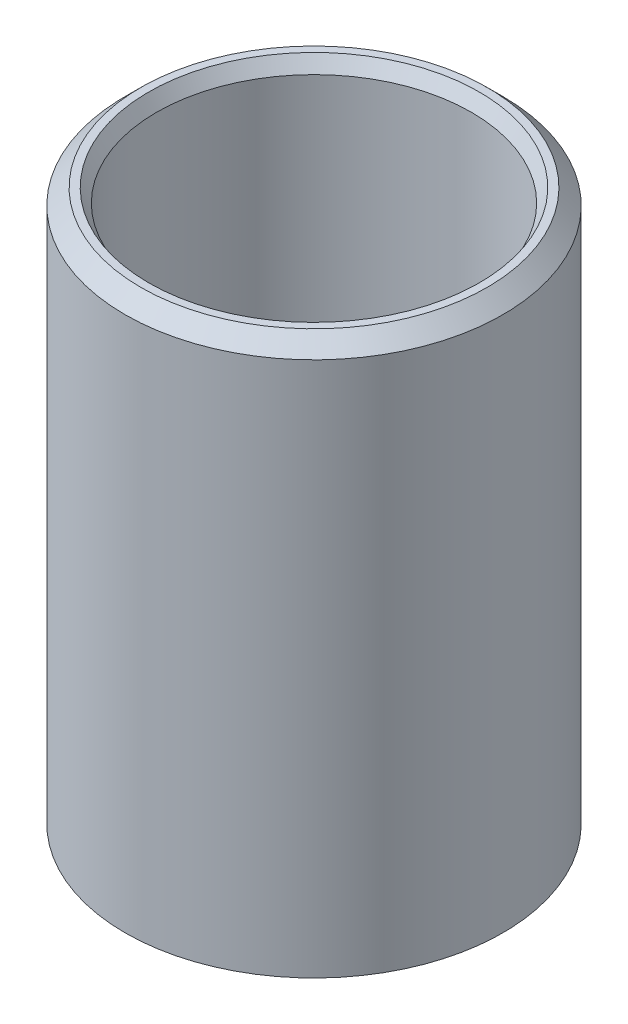
ISO-10303-21;
HEADER;
FILE_DESCRIPTION(('STEP AP214'),'2;1');
FILE_NAME('part.step','',(''),(''),'','','');
FILE_SCHEMA(('AUTOMOTIVE_DESIGN { 1 0 10303 214 1 1 1 1 }'));
ENDSEC;
DATA;
#1=APPLICATION_CONTEXT('core data for automotive mechanical design processes');
#2=APPLICATION_PROTOCOL_DEFINITION('international standard','automotive_design',2000,#1);
#3=PRODUCT_CONTEXT('',#1,'mechanical');
#4=PRODUCT('Part','Part','',(#3));
#5=PRODUCT_RELATED_PRODUCT_CATEGORY('part','',(#4));
#6=PRODUCT_DEFINITION_FORMATION('','',#4);
#7=PRODUCT_DEFINITION_CONTEXT('part definition',#1,'design');
#8=PRODUCT_DEFINITION('design','',#6,#7);
#9=PRODUCT_DEFINITION_SHAPE('','',#8);
#10=(LENGTH_UNIT() NAMED_UNIT(*) SI_UNIT(.MILLI.,.METRE.));
#11=(NAMED_UNIT(*) PLANE_ANGLE_UNIT() SI_UNIT($,.RADIAN.));
#12=(NAMED_UNIT(*) SI_UNIT($,.STERADIAN.) SOLID_ANGLE_UNIT());
#13=UNCERTAINTY_MEASURE_WITH_UNIT(LENGTH_MEASURE(1.E-05),#10,'distance_accuracy_value','');
#14=(GEOMETRIC_REPRESENTATION_CONTEXT(3) GLOBAL_UNCERTAINTY_ASSIGNED_CONTEXT((#13)) GLOBAL_UNIT_ASSIGNED_CONTEXT((#10,
#11,#12)) REPRESENTATION_CONTEXT('',''));
#15=CARTESIAN_POINT('',(0.,0.,0.));
#16=DIRECTION('',(0.,0.,1.));
#17=DIRECTION('',(1.,0.,0.));
#18=AXIS2_PLACEMENT_3D('',#15,#16,#17);
#19=CARTESIAN_POINT('',(0.,12.7,0.));
#20=DIRECTION('',(0.,1.,0.));
#21=DIRECTION('',(0.,0.,1.));
#22=AXIS2_PLACEMENT_3D('',#19,#20,#21);
#23=PLANE('',#22);
#24=CARTESIAN_POINT('',(0.,12.7,15.24));
#25=DIRECTION('',(0.,1.,0.));
#26=DIRECTION('',(0.,0.,1.));
#27=AXIS2_PLACEMENT_3D('',#24,#25,#26);
#28=CIRCLE('',#27,4.125);
#29=CARTESIAN_POINT('',(0.,12.7,19.365));
#30=VERTEX_POINT('',#29);
#31=EDGE_CURVE('E75',#30,#30,#28,.T.);
#32=ORIENTED_EDGE('',*,*,#31,.F.);
#33=EDGE_LOOP('',(#32));
#34=FACE_BOUND('',#33,.T.);
#35=CARTESIAN_POINT('',(0.,12.7,-15.24));
#36=DIRECTION('',(0.,1.,0.));
#37=DIRECTION('',(0.,0.,1.));
#38=AXIS2_PLACEMENT_3D('',#35,#36,#37);
#39=CIRCLE('',#38,4.125);
#40=CARTESIAN_POINT('',(0.,12.7,-11.115));
#41=VERTEX_POINT('',#40);
#42=EDGE_CURVE('E82',#41,#41,#39,.T.);
#43=ORIENTED_EDGE('',*,*,#42,.F.);
#44=EDGE_LOOP('',(#43));
#45=FACE_BOUND('',#44,.T.);
#46=CARTESIAN_POINT('',(0.,12.7,0.));
#47=DIRECTION('',(0.,1.,0.));
#48=DIRECTION('',(0.,0.,1.));
#49=AXIS2_PLACEMENT_3D('',#46,#47,#48);
#50=CIRCLE('',#49,25.4);
#51=CARTESIAN_POINT('',(0.,12.7,-25.4));
#52=VERTEX_POINT('',#51);
#53=EDGE_CURVE('E90',#52,#52,#50,.T.);
#54=ORIENTED_EDGE('',*,*,#53,.T.);
#55=EDGE_LOOP('',(#54));
#56=FACE_BOUND('',#55,.T.);
#57=ADVANCED_FACE('F38',(#34,#45,#56),#23,.T.);
#58=CARTESIAN_POINT('',(0.,12.7,0.));
#59=DIRECTION('',(0.,-1.,0.));
#60=DIRECTION('',(0.,0.,-1.));
#61=AXIS2_PLACEMENT_3D('',#58,#59,#60);
#62=CYLINDRICAL_SURFACE('',#61,30.48);
#63=CARTESIAN_POINT('',(0.,86.36,0.));
#64=DIRECTION('',(0.,1.,0.));
#65=DIRECTION('',(0.,0.,1.));
#66=AXIS2_PLACEMENT_3D('',#63,#64,#65);
#67=CIRCLE('',#66,30.48);
#68=CARTESIAN_POINT('',(0.,86.36,30.48));
#69=VERTEX_POINT('',#68);
#70=EDGE_CURVE('E59',#69,#69,#67,.F.);
#71=ORIENTED_EDGE('',*,*,#70,.T.);
#72=EDGE_LOOP('',(#71));
#73=FACE_BOUND('',#72,.T.);
#74=CARTESIAN_POINT('',(0.,0.,0.));
#75=DIRECTION('',(0.,1.,0.));
#76=DIRECTION('',(0.,0.,1.));
#77=AXIS2_PLACEMENT_3D('',#74,#75,#76);
#78=CIRCLE('',#77,30.48);
#79=CARTESIAN_POINT('',(0.,0.,30.48));
#80=VERTEX_POINT('',#79);
#81=EDGE_CURVE('E71',#80,#80,#78,.T.);
#82=ORIENTED_EDGE('',*,*,#81,.T.);
#83=EDGE_LOOP('',(#82));
#84=FACE_BOUND('',#83,.T.);
#85=ADVANCED_FACE('F114',(#73,#84),#62,.T.);
#86=CARTESIAN_POINT('',(0.,0.,0.));
#87=DIRECTION('',(0.,1.,0.));
#88=DIRECTION('',(0.,0.,1.));
#89=AXIS2_PLACEMENT_3D('',#86,#87,#88);
#90=PLANE('',#89);
#91=CARTESIAN_POINT('',(0.,0.,-15.24));
#92=DIRECTION('',(0.,1.,0.));
#93=DIRECTION('',(0.,0.,1.));
#94=AXIS2_PLACEMENT_3D('',#91,#92,#93);
#95=CIRCLE('',#94,2.36661742093533);
#96=CARTESIAN_POINT('',(0.,0.,-12.8733825790647));
#97=VERTEX_POINT('',#96);
#98=EDGE_CURVE('E50',#97,#97,#95,.T.);
#99=ORIENTED_EDGE('',*,*,#98,.T.);
#100=EDGE_LOOP('',(#99));
#101=FACE_BOUND('',#100,.T.);
#102=CARTESIAN_POINT('',(0.,0.,15.24));
#103=DIRECTION('',(0.,1.,0.));
#104=DIRECTION('',(0.,0.,1.));
#105=AXIS2_PLACEMENT_3D('',#102,#103,#104);
#106=CIRCLE('',#105,2.36661742093535);
#107=CARTESIAN_POINT('',(0.,0.,17.6066174209354));
#108=VERTEX_POINT('',#107);
#109=EDGE_CURVE('E54',#108,#108,#106,.T.);
#110=ORIENTED_EDGE('',*,*,#109,.T.);
#111=EDGE_LOOP('',(#110));
#112=FACE_BOUND('',#111,.T.);
#113=ORIENTED_EDGE('',*,*,#81,.F.);
#114=EDGE_LOOP('',(#113));
#115=FACE_BOUND('',#114,.T.);
#116=ADVANCED_FACE('F120',(#101,#112,#115),#90,.F.);
#117=CARTESIAN_POINT('',(0.,7.62,15.24));
#118=DIRECTION('',(0.,1.,0.));
#119=DIRECTION('',(0.,0.,1.));
#120=AXIS2_PLACEMENT_3D('',#117,#118,#119);
#121=CYLINDRICAL_SURFACE('',#120,4.125);
#122=CARTESIAN_POINT('',(0.,7.62,15.24));
#123=DIRECTION('',(0.,1.,0.));
#124=DIRECTION('',(0.,0.,1.));
#125=AXIS2_PLACEMENT_3D('',#122,#123,#124);
#126=CIRCLE('',#125,4.125);
#127=CARTESIAN_POINT('',(0.,7.62,19.365));
#128=VERTEX_POINT('',#127);
#129=EDGE_CURVE('E78',#128,#128,#126,.T.);
#130=ORIENTED_EDGE('',*,*,#129,.F.);
#131=EDGE_LOOP('',(#130));
#132=FACE_BOUND('',#131,.T.);
#133=ORIENTED_EDGE('',*,*,#31,.T.);
#134=EDGE_LOOP('',(#133));
#135=FACE_BOUND('',#134,.T.);
#136=ADVANCED_FACE('F127',(#132,#135),#121,.F.);
#137=CARTESIAN_POINT('',(0.,7.62,0.));
#138=DIRECTION('',(0.,1.,0.));
#139=DIRECTION('',(0.,0.,1.));
#140=AXIS2_PLACEMENT_3D('',#137,#138,#139);
#141=PLANE('',#140);
#142=CARTESIAN_POINT('',(0.,7.62,15.24));
#143=DIRECTION('',(0.,1.,0.));
#144=DIRECTION('',(0.,0.,1.));
#145=AXIS2_PLACEMENT_3D('',#142,#143,#144);
#146=CIRCLE('',#145,2.);
#147=CARTESIAN_POINT('',(0.,7.62,17.24));
#148=VERTEX_POINT('',#147);
#149=EDGE_CURVE('E87',#148,#148,#146,.T.);
#150=ORIENTED_EDGE('',*,*,#149,.F.);
#151=EDGE_LOOP('',(#150));
#152=FACE_BOUND('',#151,.T.);
#153=ORIENTED_EDGE('',*,*,#129,.T.);
#154=EDGE_LOOP('',(#153));
#155=FACE_BOUND('',#154,.T.);
#156=ADVANCED_FACE('F240',(#152,#155),#141,.T.);
#157=CARTESIAN_POINT('',(0.,7.62,-15.24));
#158=DIRECTION('',(0.,1.,0.));
#159=DIRECTION('',(0.,0.,1.));
#160=AXIS2_PLACEMENT_3D('',#157,#158,#159);
#161=CYLINDRICAL_SURFACE('',#160,4.125);
#162=CARTESIAN_POINT('',(0.,7.62,-15.24));
#163=DIRECTION('',(0.,1.,0.));
#164=DIRECTION('',(0.,0.,1.));
#165=AXIS2_PLACEMENT_3D('',#162,#163,#164);
#166=CIRCLE('',#165,4.125);
#167=CARTESIAN_POINT('',(0.,7.62,-11.115));
#168=VERTEX_POINT('',#167);
#169=EDGE_CURVE('E74',#168,#168,#166,.T.);
#170=ORIENTED_EDGE('',*,*,#169,.F.);
#171=EDGE_LOOP('',(#170));
#172=FACE_BOUND('',#171,.T.);
#173=ORIENTED_EDGE('',*,*,#42,.T.);
#174=EDGE_LOOP('',(#173));
#175=FACE_BOUND('',#174,.T.);
#176=ADVANCED_FACE('F232',(#172,#175),#161,.F.);
#177=CARTESIAN_POINT('',(0.,7.62,0.));
#178=DIRECTION('',(0.,1.,0.));
#179=DIRECTION('',(0.,0.,1.));
#180=AXIS2_PLACEMENT_3D('',#177,#178,#179);
#181=PLANE('',#180);
#182=CARTESIAN_POINT('',(0.,7.62,-15.24));
#183=DIRECTION('',(0.,1.,0.));
#184=DIRECTION('',(0.,0.,1.));
#185=AXIS2_PLACEMENT_3D('',#182,#183,#184);
#186=CIRCLE('',#185,2.);
#187=CARTESIAN_POINT('',(0.,7.62,-13.24));
#188=VERTEX_POINT('',#187);
#189=EDGE_CURVE('E79',#188,#188,#186,.T.);
#190=ORIENTED_EDGE('',*,*,#189,.F.);
#191=EDGE_LOOP('',(#190));
#192=FACE_BOUND('',#191,.T.);
#193=ORIENTED_EDGE('',*,*,#169,.T.);
#194=EDGE_LOOP('',(#193));
#195=FACE_BOUND('',#194,.T.);
#196=ADVANCED_FACE('F184',(#192,#195),#181,.T.);
#197=CARTESIAN_POINT('',(0.,0.,15.24));
#198=DIRECTION('',(0.,1.,0.));
#199=DIRECTION('',(0.,0.,1.));
#200=AXIS2_PLACEMENT_3D('',#197,#198,#199);
#201=CYLINDRICAL_SURFACE('',#200,2.);
#202=CARTESIAN_POINT('',(0.,0.63499999999989,15.24));
#203=DIRECTION('',(0.,1.,0.));
#204=DIRECTION('',(0.,0.,1.));
#205=AXIS2_PLACEMENT_3D('',#202,#203,#204);
#206=CIRCLE('',#205,2.);
#207=CARTESIAN_POINT('',(0.,0.634999999999889,17.24));
#208=VERTEX_POINT('',#207);
#209=EDGE_CURVE('E10',#208,#208,#206,.F.);
#210=CARTESIAN_POINT('',(0.,0.634999999999889,17.24));
#211=CARTESIAN_POINT('',(0.,0.707760416666557,17.24));
#212=CARTESIAN_POINT('',(0.,0.780520833333225,17.24));
#213=CARTESIAN_POINT('',(0.,0.926041666666561,17.24));
#214=CARTESIAN_POINT('',(0.,0.998802083333228,17.24));
#215=CARTESIAN_POINT('',(0.,1.14432291666656,17.24));
#216=CARTESIAN_POINT('',(0.,1.21708333333323,17.24));
#217=CARTESIAN_POINT('',(0.,1.36260416666657,17.24));
#218=CARTESIAN_POINT('',(0.,1.43536458333324,17.24));
#219=CARTESIAN_POINT('',(0.,1.58088541666657,17.24));
#220=CARTESIAN_POINT('',(0.,1.65364583333324,17.24));
#221=CARTESIAN_POINT('',(0.,1.79916666666657,17.24));
#222=CARTESIAN_POINT('',(0.,1.87192708333324,17.24));
#223=CARTESIAN_POINT('',(0.,2.01744791666658,17.24));
#224=CARTESIAN_POINT('',(0.,2.09020833333325,17.24));
#225=CARTESIAN_POINT('',(0.,2.23572916666658,17.24));
#226=CARTESIAN_POINT('',(0.,2.30848958333325,17.24));
#227=CARTESIAN_POINT('',(0.,2.45401041666659,17.24));
#228=CARTESIAN_POINT('',(0.,2.52677083333325,17.24));
#229=CARTESIAN_POINT('',(0.,2.67229166666659,17.24));
#230=CARTESIAN_POINT('',(0.,2.74505208333326,17.24));
#231=CARTESIAN_POINT('',(0.,2.89057291666659,17.24));
#232=CARTESIAN_POINT('',(0.,2.96333333333326,17.24));
#233=CARTESIAN_POINT('',(0.,3.1088541666666,17.24));
#234=CARTESIAN_POINT('',(0.,3.18161458333326,17.24));
#235=CARTESIAN_POINT('',(0.,3.3271354166666,17.24));
#236=CARTESIAN_POINT('',(0.,3.39989583333327,17.24));
#237=CARTESIAN_POINT('',(0.,3.5454166666666,17.24));
#238=CARTESIAN_POINT('',(0.,3.61817708333327,17.24));
#239=CARTESIAN_POINT('',(0.,3.76369791666661,17.24));
#240=CARTESIAN_POINT('',(0.,3.83645833333327,17.24));
#241=CARTESIAN_POINT('',(0.,3.98197916666661,17.24));
#242=CARTESIAN_POINT('',(0.,4.05473958333328,17.24));
#243=CARTESIAN_POINT('',(0.,4.20026041666661,17.24));
#244=CARTESIAN_POINT('',(0.,4.27302083333328,17.24));
#245=CARTESIAN_POINT('',(0.,4.41854166666662,17.24));
#246=CARTESIAN_POINT('',(0.,4.49130208333328,17.24));
#247=CARTESIAN_POINT('',(0.,4.63682291666662,17.24));
#248=CARTESIAN_POINT('',(0.,4.70958333333329,17.24));
#249=CARTESIAN_POINT('',(0.,4.85510416666662,17.24));
#250=CARTESIAN_POINT('',(0.,4.92786458333329,17.24));
#251=CARTESIAN_POINT('',(0.,5.07338541666663,17.24));
#252=CARTESIAN_POINT('',(0.,5.14614583333329,17.24));
#253=CARTESIAN_POINT('',(0.,5.29166666666663,17.24));
#254=CARTESIAN_POINT('',(0.,5.3644270833333,17.24));
#255=CARTESIAN_POINT('',(0.,5.50994791666663,17.24));
#256=CARTESIAN_POINT('',(0.,5.5827083333333,17.24));
#257=CARTESIAN_POINT('',(0.,5.72822916666664,17.24));
#258=CARTESIAN_POINT('',(0.,5.8009895833333,17.24));
#259=CARTESIAN_POINT('',(0.,5.94651041666664,17.24));
#260=CARTESIAN_POINT('',(0.,6.01927083333331,17.24));
#261=CARTESIAN_POINT('',(0.,6.16479166666664,17.24));
#262=CARTESIAN_POINT('',(0.,6.23755208333331,17.24));
#263=CARTESIAN_POINT('',(0.,6.38307291666665,17.24));
#264=CARTESIAN_POINT('',(0.,6.45583333333331,17.24));
#265=CARTESIAN_POINT('',(0.,6.60135416666665,17.24));
#266=CARTESIAN_POINT('',(0.,6.67411458333332,17.24));
#267=CARTESIAN_POINT('',(0.,6.81963541666665,17.24));
#268=CARTESIAN_POINT('',(0.,6.89239583333332,17.24));
#269=CARTESIAN_POINT('',(0.,7.03791666666666,17.24));
#270=CARTESIAN_POINT('',(0.,7.11067708333333,17.24));
#271=CARTESIAN_POINT('',(0.,7.25619791666666,17.24));
#272=CARTESIAN_POINT('',(0.,7.32895833333333,17.24));
#273=CARTESIAN_POINT('',(0.,7.47447916666666,17.24));
#274=CARTESIAN_POINT('',(0.,7.54723958333333,17.24));
#275=CARTESIAN_POINT('',(0.,7.62,17.24));
#276=B_SPLINE_CURVE_WITH_KNOTS('',3,(#210,#211,#212,#213,#214,#215,#216,#217,#218,#219,#220,
#221,#222,#223,#224,#225,#226,#227,#228,#229,#230,#231,#232,#233,#234,#235,#236,#237,#238,#239,
#240,#241,#242,#243,#244,#245,#246,#247,#248,#249,#250,#251,#252,#253,#254,#255,#256,#257,#258,
#259,#260,#261,#262,#263,#264,#265,#266,#267,#268,#269,#270,#271,#272,#273,#274,#275),
.UNSPECIFIED.,.F.,.F.,(4,2,2,2,2,2,2,2,2,2,2,2,2,2,2,2,2,2,2,2,2,2,2,2,2,2,2,2,2,2,2,2,4),(0.,
0.218281250000003,0.436562500000007,0.65484375000001,0.873125000000014,1.09140625000002,
1.30968750000002,1.52796875000002,1.74625000000003,1.96453125000003,2.18281250000003,
2.40109375000004,2.61937500000004,2.83765625000005,3.05593750000005,3.27421875000005,
3.49250000000006,3.71078125000006,3.92906250000006,4.14734375000007,4.36562500000007,
4.58390625000007,4.80218750000008,5.02046875000008,5.23875000000008,5.45703125000009,
5.67531250000009,5.89359375000009,6.1118750000001,6.3301562500001,6.5484375000001,
6.76671875000011,6.98500000000011),.UNSPECIFIED.);
#277=EDGE_CURVE('BSEAM174',#208,#148,#276,.T.);
#278=ORIENTED_EDGE('',*,*,#209,.T.);
#279=ORIENTED_EDGE('',*,*,#149,.T.);
#280=ORIENTED_EDGE('',*,*,#277,.T.);
#281=ORIENTED_EDGE('',*,*,#277,.F.);
#282=EDGE_LOOP('',(#278,#280,#279,#281));
#283=FACE_BOUND('',#282,.T.);
#284=ADVANCED_FACE('F174',(#283),#201,.F.);
#285=CARTESIAN_POINT('',(0.,0.,-15.24));
#286=DIRECTION('',(0.,1.,0.));
#287=DIRECTION('',(0.,0.,1.));
#288=AXIS2_PLACEMENT_3D('',#285,#286,#287);
#289=CYLINDRICAL_SURFACE('',#288,2.);
#290=CARTESIAN_POINT('',(0.,0.634999999999881,-15.24));
#291=DIRECTION('',(0.,1.,0.));
#292=DIRECTION('',(0.,0.,1.));
#293=AXIS2_PLACEMENT_3D('',#290,#291,#292);
#294=CIRCLE('',#293,2.);
#295=CARTESIAN_POINT('',(0.,0.634999999999881,-13.24));
#296=VERTEX_POINT('',#295);
#297=EDGE_CURVE('E46',#296,#296,#294,.F.);
#298=CARTESIAN_POINT('',(0.,0.634999999999881,-13.24));
#299=CARTESIAN_POINT('',(0.,0.707760416666549,-13.24));
#300=CARTESIAN_POINT('',(0.,0.780520833333217,-13.24));
#301=CARTESIAN_POINT('',(0.,0.926041666666553,-13.24));
#302=CARTESIAN_POINT('',(0.,0.998802083333221,-13.24));
#303=CARTESIAN_POINT('',(0.,1.14432291666656,-13.24));
#304=CARTESIAN_POINT('',(0.,1.21708333333322,-13.24));
#305=CARTESIAN_POINT('',(0.,1.36260416666656,-13.24));
#306=CARTESIAN_POINT('',(0.,1.43536458333323,-13.24));
#307=CARTESIAN_POINT('',(0.,1.58088541666656,-13.24));
#308=CARTESIAN_POINT('',(0.,1.65364583333323,-13.24));
#309=CARTESIAN_POINT('',(0.,1.79916666666657,-13.24));
#310=CARTESIAN_POINT('',(0.,1.87192708333324,-13.24));
#311=CARTESIAN_POINT('',(0.,2.01744791666657,-13.24));
#312=CARTESIAN_POINT('',(0.,2.09020833333324,-13.24));
#313=CARTESIAN_POINT('',(0.,2.23572916666657,-13.24));
#314=CARTESIAN_POINT('',(0.,2.30848958333324,-13.24));
#315=CARTESIAN_POINT('',(0.,2.45401041666658,-13.24));
#316=CARTESIAN_POINT('',(0.,2.52677083333325,-13.24));
#317=CARTESIAN_POINT('',(0.,2.67229166666658,-13.24));
#318=CARTESIAN_POINT('',(0.,2.74505208333325,-13.24));
#319=CARTESIAN_POINT('',(0.,2.89057291666659,-13.24));
#320=CARTESIAN_POINT('',(0.,2.96333333333325,-13.24));
#321=CARTESIAN_POINT('',(0.,3.10885416666659,-13.24));
#322=CARTESIAN_POINT('',(0.,3.18161458333326,-13.24));
#323=CARTESIAN_POINT('',(0.,3.32713541666659,-13.24));
#324=CARTESIAN_POINT('',(0.,3.39989583333326,-13.24));
#325=CARTESIAN_POINT('',(0.,3.5454166666666,-13.24));
#326=CARTESIAN_POINT('',(0.,3.61817708333326,-13.24));
#327=CARTESIAN_POINT('',(0.,3.7636979166666,-13.24));
#328=CARTESIAN_POINT('',(0.,3.83645833333327,-13.24));
#329=CARTESIAN_POINT('',(0.,3.9819791666666,-13.24));
#330=CARTESIAN_POINT('',(0.,4.05473958333327,-13.24));
#331=CARTESIAN_POINT('',(0.,4.20026041666661,-13.24));
#332=CARTESIAN_POINT('',(0.,4.27302083333328,-13.24));
#333=CARTESIAN_POINT('',(0.,4.41854166666661,-13.24));
#334=CARTESIAN_POINT('',(0.,4.49130208333328,-13.24));
#335=CARTESIAN_POINT('',(0.,4.63682291666662,-13.24));
#336=CARTESIAN_POINT('',(0.,4.70958333333328,-13.24));
#337=CARTESIAN_POINT('',(0.,4.85510416666662,-13.24));
#338=CARTESIAN_POINT('',(0.,4.92786458333329,-13.24));
#339=CARTESIAN_POINT('',(0.,5.07338541666662,-13.24));
#340=CARTESIAN_POINT('',(0.,5.14614583333329,-13.24));
#341=CARTESIAN_POINT('',(0.,5.29166666666663,-13.24));
#342=CARTESIAN_POINT('',(0.,5.36442708333329,-13.24));
#343=CARTESIAN_POINT('',(0.,5.50994791666663,-13.24));
#344=CARTESIAN_POINT('',(0.,5.5827083333333,-13.24));
#345=CARTESIAN_POINT('',(0.,5.72822916666663,-13.24));
#346=CARTESIAN_POINT('',(0.,5.8009895833333,-13.24));
#347=CARTESIAN_POINT('',(0.,5.94651041666664,-13.24));
#348=CARTESIAN_POINT('',(0.,6.01927083333331,-13.24));
#349=CARTESIAN_POINT('',(0.,6.16479166666664,-13.24));
#350=CARTESIAN_POINT('',(0.,6.23755208333331,-13.24));
#351=CARTESIAN_POINT('',(0.,6.38307291666664,-13.24));
#352=CARTESIAN_POINT('',(0.,6.45583333333331,-13.24));
#353=CARTESIAN_POINT('',(0.,6.60135416666665,-13.24));
#354=CARTESIAN_POINT('',(0.,6.67411458333332,-13.24));
#355=CARTESIAN_POINT('',(0.,6.81963541666665,-13.24));
#356=CARTESIAN_POINT('',(0.,6.89239583333332,-13.24));
#357=CARTESIAN_POINT('',(0.,7.03791666666666,-13.24));
#358=CARTESIAN_POINT('',(0.,7.11067708333332,-13.24));
#359=CARTESIAN_POINT('',(0.,7.25619791666666,-13.24));
#360=CARTESIAN_POINT('',(0.,7.32895833333333,-13.24));
#361=CARTESIAN_POINT('',(0.,7.47447916666666,-13.24));
#362=CARTESIAN_POINT('',(0.,7.54723958333333,-13.24));
#363=CARTESIAN_POINT('',(0.,7.62,-13.24));
#364=B_SPLINE_CURVE_WITH_KNOTS('',3,(#298,#299,#300,#301,#302,#303,#304,#305,#306,#307,#308,
#309,#310,#311,#312,#313,#314,#315,#316,#317,#318,#319,#320,#321,#322,#323,#324,#325,#326,#327,
#328,#329,#330,#331,#332,#333,#334,#335,#336,#337,#338,#339,#340,#341,#342,#343,#344,#345,#346,
#347,#348,#349,#350,#351,#352,#353,#354,#355,#356,#357,#358,#359,#360,#361,#362,#363),
.UNSPECIFIED.,.F.,.F.,(4,2,2,2,2,2,2,2,2,2,2,2,2,2,2,2,2,2,2,2,2,2,2,2,2,2,2,2,2,2,2,2,4),(0.,
0.218281250000004,0.436562500000007,0.654843750000011,0.873125000000015,1.09140625000002,
1.30968750000002,1.52796875000003,1.74625000000003,1.96453125000003,2.18281250000004,
2.40109375000004,2.61937500000004,2.83765625000005,3.05593750000005,3.27421875000005,
3.49250000000006,3.71078125000006,3.92906250000007,4.14734375000007,4.36562500000007,
4.58390625000008,4.80218750000008,5.02046875000008,5.23875000000009,5.45703125000009,
5.6753125000001,5.8935937500001,6.1118750000001,6.33015625000011,6.54843750000011,
6.76671875000011,6.98500000000012),.UNSPECIFIED.);
#365=EDGE_CURVE('BSEAM110',#296,#188,#364,.T.);
#366=ORIENTED_EDGE('',*,*,#297,.T.);
#367=ORIENTED_EDGE('',*,*,#189,.T.);
#368=ORIENTED_EDGE('',*,*,#365,.T.);
#369=ORIENTED_EDGE('',*,*,#365,.F.);
#370=EDGE_LOOP('',(#366,#368,#367,#369));
#371=FACE_BOUND('',#370,.T.);
#372=ADVANCED_FACE('F110',(#371),#289,.F.);
#373=CARTESIAN_POINT('',(0.,88.9,0.));
#374=DIRECTION('',(0.,1.,0.));
#375=DIRECTION('',(0.,0.,1.));
#376=AXIS2_PLACEMENT_3D('',#373,#374,#375);
#377=PLANE('',#376);
#378=CARTESIAN_POINT('',(0.,88.9,0.));
#379=DIRECTION('',(0.,1.,0.));
#380=DIRECTION('',(0.,0.,1.));
#381=AXIS2_PLACEMENT_3D('',#378,#379,#380);
#382=CIRCLE('',#381,27.94);
#383=CARTESIAN_POINT('',(0.,88.9,27.94));
#384=VERTEX_POINT('',#383);
#385=EDGE_CURVE('E62',#384,#384,#382,.T.);
#386=ORIENTED_EDGE('',*,*,#385,.T.);
#387=EDGE_LOOP('',(#386));
#388=FACE_BOUND('',#387,.T.);
#389=CARTESIAN_POINT('',(0.,88.9,0.));
#390=DIRECTION('',(0.,1.,0.));
#391=DIRECTION('',(0.,0.,1.));
#392=AXIS2_PLACEMENT_3D('',#389,#390,#391);
#393=CIRCLE('',#392,26.67);
#394=CARTESIAN_POINT('',(0.,88.9,26.67));
#395=VERTEX_POINT('',#394);
#396=EDGE_CURVE('E65',#395,#395,#393,.F.);
#397=ORIENTED_EDGE('',*,*,#396,.T.);
#398=EDGE_LOOP('',(#397));
#399=FACE_BOUND('',#398,.T.);
#400=ADVANCED_FACE('F100',(#388,#399),#377,.T.);
#401=CARTESIAN_POINT('',(0.,88.9,0.));
#402=DIRECTION('',(0.,-1.,0.));
#403=DIRECTION('',(0.,0.,-1.));
#404=AXIS2_PLACEMENT_3D('',#401,#402,#403);
#405=CYLINDRICAL_SURFACE('',#404,25.4);
#406=CARTESIAN_POINT('',(0.,86.7002954743875,0.));
#407=DIRECTION('',(0.,1.,0.));
#408=DIRECTION('',(0.,0.,1.));
#409=AXIS2_PLACEMENT_3D('',#406,#407,#408);
#410=CIRCLE('',#409,25.4);
#411=CARTESIAN_POINT('',(0.,86.7002954743875,-25.4));
#412=VERTEX_POINT('',#411);
#413=EDGE_CURVE('E68',#412,#412,#410,.T.);
#414=CARTESIAN_POINT('',(0.,86.7002954743875,-25.4));
#415=CARTESIAN_POINT('',(0.,85.9294590631959,-25.4));
#416=CARTESIAN_POINT('',(0.,85.1586226520044,-25.4));
#417=CARTESIAN_POINT('',(0.,83.6169498296213,-25.4));
#418=CARTESIAN_POINT('',(0.,82.8461134184298,-25.4));
#419=CARTESIAN_POINT('',(0.,81.3044405960467,-25.4));
#420=CARTESIAN_POINT('',(0.,80.5336041848552,-25.4));
#421=CARTESIAN_POINT('',(0.,78.9919313624721,-25.4));
#422=CARTESIAN_POINT('',(0.,78.2210949512806,-25.4));
#423=CARTESIAN_POINT('',(0.,76.6794221288975,-25.4));
#424=CARTESIAN_POINT('',(0.,75.908585717706,-25.4));
#425=CARTESIAN_POINT('',(0.,74.3669128953229,-25.4));
#426=CARTESIAN_POINT('',(0.,73.5960764841314,-25.4));
#427=CARTESIAN_POINT('',(0.,72.0544036617483,-25.4));
#428=CARTESIAN_POINT('',(0.,71.2835672505567,-25.4));
#429=CARTESIAN_POINT('',(0.,69.7418944281737,-25.4));
#430=CARTESIAN_POINT('',(0.,68.9710580169821,-25.4));
#431=CARTESIAN_POINT('',(0.,67.4293851945991,-25.4));
#432=CARTESIAN_POINT('',(0.,66.6585487834075,-25.4));
#433=CARTESIAN_POINT('',(0.,65.1168759610245,-25.4));
#434=CARTESIAN_POINT('',(0.,64.3460395498329,-25.4));
#435=CARTESIAN_POINT('',(0.,62.8043667274499,-25.4));
#436=CARTESIAN_POINT('',(0.,62.0335303162583,-25.4));
#437=CARTESIAN_POINT('',(0.,60.4918574938752,-25.4));
#438=CARTESIAN_POINT('',(0.,59.7210210826837,-25.4));
#439=CARTESIAN_POINT('',(0.,58.1793482603006,-25.4));
#440=CARTESIAN_POINT('',(0.,57.4085118491091,-25.4));
#441=CARTESIAN_POINT('',(0.,55.866839026726,-25.4));
#442=CARTESIAN_POINT('',(0.,55.0960026155345,-25.4));
#443=CARTESIAN_POINT('',(0.,53.5543297931514,-25.4));
#444=CARTESIAN_POINT('',(0.,52.7834933819599,-25.4));
#445=CARTESIAN_POINT('',(0.,51.2418205595768,-25.4));
#446=CARTESIAN_POINT('',(0.,50.4709841483853,-25.4));
#447=CARTESIAN_POINT('',(0.,48.9293113260022,-25.4));
#448=CARTESIAN_POINT('',(0.,48.1584749148107,-25.4));
#449=CARTESIAN_POINT('',(0.,46.6168020924276,-25.4));
#450=CARTESIAN_POINT('',(0.,45.8459656812361,-25.4));
#451=CARTESIAN_POINT('',(0.,44.304292858853,-25.4));
#452=CARTESIAN_POINT('',(0.,43.5334564476615,-25.4));
#453=CARTESIAN_POINT('',(0.,41.9917836252784,-25.4));
#454=CARTESIAN_POINT('',(0.,41.2209472140868,-25.4));
#455=CARTESIAN_POINT('',(0.,39.6792743917038,-25.4));
#456=CARTESIAN_POINT('',(0.,38.9084379805122,-25.4));
#457=CARTESIAN_POINT('',(0.,37.3667651581292,-25.4));
#458=CARTESIAN_POINT('',(0.,36.5959287469376,-25.4));
#459=CARTESIAN_POINT('',(0.,35.0542559245546,-25.4));
#460=CARTESIAN_POINT('',(0.,34.283419513363,-25.4));
#461=CARTESIAN_POINT('',(0.,32.7417466909799,-25.4));
#462=CARTESIAN_POINT('',(0.,31.9709102797884,-25.4));
#463=CARTESIAN_POINT('',(0.,30.4292374574053,-25.4));
#464=CARTESIAN_POINT('',(0.,29.6584010462138,-25.4));
#465=CARTESIAN_POINT('',(0.,28.1167282238307,-25.4));
#466=CARTESIAN_POINT('',(0.,27.3458918126392,-25.4));
#467=CARTESIAN_POINT('',(0.,25.8042189902561,-25.4));
#468=CARTESIAN_POINT('',(0.,25.0333825790646,-25.4));
#469=CARTESIAN_POINT('',(0.,23.4917097566815,-25.4));
#470=CARTESIAN_POINT('',(0.,22.72087334549,-25.4));
#471=CARTESIAN_POINT('',(0.,21.1792005231069,-25.4));
#472=CARTESIAN_POINT('',(0.,20.4083641119154,-25.4));
#473=CARTESIAN_POINT('',(0.,18.8666912895323,-25.4));
#474=CARTESIAN_POINT('',(0.,18.0958548783408,-25.4));
#475=CARTESIAN_POINT('',(0.,16.5541820559577,-25.4));
#476=CARTESIAN_POINT('',(0.,15.7833456447662,-25.4));
#477=CARTESIAN_POINT('',(0.,14.2416728223831,-25.4));
#478=CARTESIAN_POINT('',(0.,13.4708364111915,-25.4));
#479=CARTESIAN_POINT('',(0.,12.7,-25.4));
#480=B_SPLINE_CURVE_WITH_KNOTS('',3,(#414,#415,#416,#417,#418,#419,#420,#421,#422,#423,#424,
#425,#426,#427,#428,#429,#430,#431,#432,#433,#434,#435,#436,#437,#438,#439,#440,#441,#442,#443,
#444,#445,#446,#447,#448,#449,#450,#451,#452,#453,#454,#455,#456,#457,#458,#459,#460,#461,#462,
#463,#464,#465,#466,#467,#468,#469,#470,#471,#472,#473,#474,#475,#476,#477,#478,#479),
.UNSPECIFIED.,.F.,.F.,(4,2,2,2,2,2,2,2,2,2,2,2,2,2,2,2,2,2,2,2,2,2,2,2,2,2,2,2,2,2,2,2,4),(0.,
2.31250923357461,4.62501846714922,6.93752770072382,9.25003693429843,11.562546167873,
13.8750554014476,16.1875646350223,18.5000738685969,20.8125831021715,23.1250923357461,
25.4376015693207,27.7501108028953,30.0626200364699,32.3751292700445,34.6876385036191,
37.0001477371937,39.3126569707683,41.625166204343,43.9376754379176,46.2501846714922,
48.5626939050668,50.8752031386414,53.187712372216,55.5002216057906,57.8127308393652,
60.1252400729398,62.4377493065144,64.750258540089,67.0627677736636,69.3752770072383,
71.6877862408128,74.0002954743875),.UNSPECIFIED.);
#481=EDGE_CURVE('BSEAM97',#412,#52,#480,.T.);
#482=ORIENTED_EDGE('',*,*,#413,.T.);
#483=ORIENTED_EDGE('',*,*,#53,.F.);
#484=ORIENTED_EDGE('',*,*,#481,.T.);
#485=ORIENTED_EDGE('',*,*,#481,.F.);
#486=EDGE_LOOP('',(#482,#484,#483,#485));
#487=FACE_BOUND('',#486,.T.);
#488=ADVANCED_FACE('F97',(#487),#405,.F.);
#489=CARTESIAN_POINT('',(0.,86.7002954743875,0.));
#490=DIRECTION('',(0.,1.,0.));
#491=DIRECTION('',(0.,0.,1.));
#492=AXIS2_PLACEMENT_3D('',#489,#490,#491);
#493=CONICAL_SURFACE('',#492,25.4,0.523598775598291);
#494=ORIENTED_EDGE('',*,*,#396,.F.);
#495=EDGE_LOOP('',(#494));
#496=FACE_BOUND('',#495,.T.);
#497=ORIENTED_EDGE('',*,*,#413,.F.);
#498=EDGE_LOOP('',(#497));
#499=FACE_BOUND('',#498,.T.);
#500=ADVANCED_FACE('F99',(#496,#499),#493,.F.);
#501=CARTESIAN_POINT('',(0.,88.9,0.));
#502=DIRECTION('',(0.,-1.,0.));
#503=DIRECTION('',(0.,0.,-1.));
#504=AXIS2_PLACEMENT_3D('',#501,#502,#503);
#505=CONICAL_SURFACE('',#504,27.94,0.785398163397444);
#506=ORIENTED_EDGE('',*,*,#70,.F.);
#507=EDGE_LOOP('',(#506));
#508=FACE_BOUND('',#507,.T.);
#509=ORIENTED_EDGE('',*,*,#385,.F.);
#510=EDGE_LOOP('',(#509));
#511=FACE_BOUND('',#510,.T.);
#512=ADVANCED_FACE('F107',(#508,#511),#505,.T.);
#513=CARTESIAN_POINT('',(0.,0.,-15.24));
#514=DIRECTION('',(0.,-1.,0.));
#515=DIRECTION('',(0.,0.,-1.));
#516=AXIS2_PLACEMENT_3D('',#513,#514,#515);
#517=CONICAL_SURFACE('',#516,2.36661742093533,0.523598775598288);
#518=ORIENTED_EDGE('',*,*,#297,.F.);
#519=EDGE_LOOP('',(#518));
#520=FACE_BOUND('',#519,.T.);
#521=ORIENTED_EDGE('',*,*,#98,.F.);
#522=EDGE_LOOP('',(#521));
#523=FACE_BOUND('',#522,.T.);
#524=ADVANCED_FACE('F140',(#520,#523),#517,.F.);
#525=CARTESIAN_POINT('',(0.,0.,15.24));
#526=DIRECTION('',(0.,-1.,0.));
#527=DIRECTION('',(0.,0.,-1.));
#528=AXIS2_PLACEMENT_3D('',#525,#526,#527);
#529=CONICAL_SURFACE('',#528,2.36661742093535,0.523598775598301);
#530=ORIENTED_EDGE('',*,*,#209,.F.);
#531=EDGE_LOOP('',(#530));
#532=FACE_BOUND('',#531,.T.);
#533=ORIENTED_EDGE('',*,*,#109,.F.);
#534=EDGE_LOOP('',(#533));
#535=FACE_BOUND('',#534,.T.);
#536=ADVANCED_FACE('F41',(#532,#535),#529,.F.);
#537=CLOSED_SHELL('',(#57,#85,#116,#136,#156,#176,#196,#284,#372,#400,#488,#500,#512,#524,#536));
#538=MANIFOLD_SOLID_BREP('B2',#537);
#539=ADVANCED_BREP_SHAPE_REPRESENTATION('',(#18,#538),#14);
#540=SHAPE_DEFINITION_REPRESENTATION(#9,#539);
ENDSEC;
END-ISO-10303-21;
